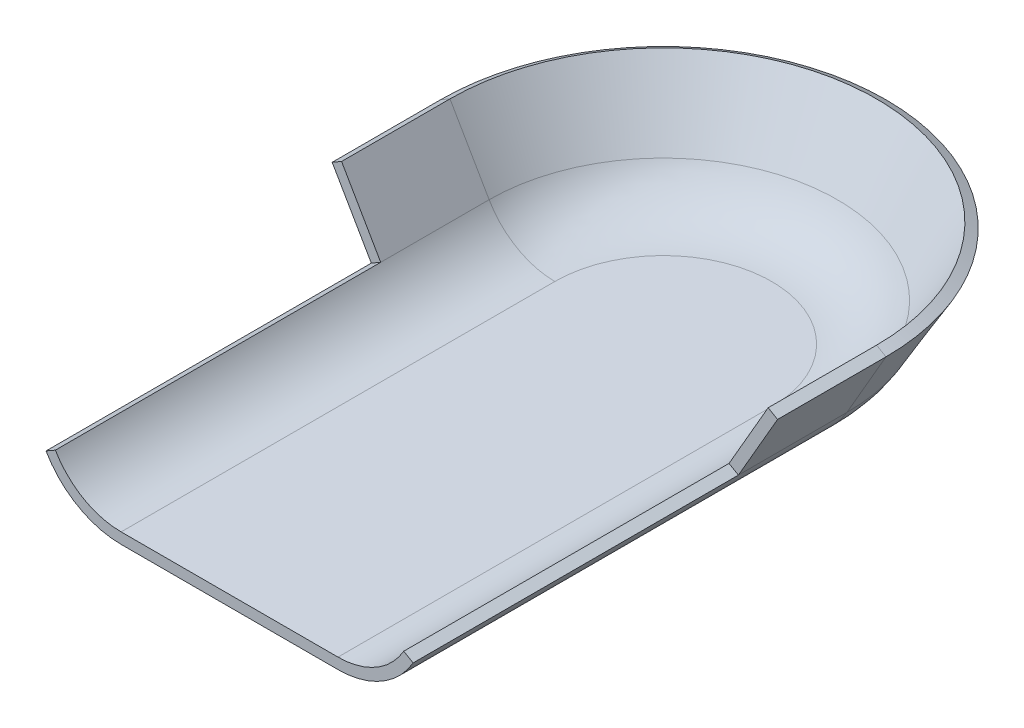
ISO-10303-21;
HEADER;
FILE_DESCRIPTION(('STEP AP214'),'2;1');
FILE_NAME('part.step','',(''),(''),'','','');
FILE_SCHEMA(('AUTOMOTIVE_DESIGN { 1 0 10303 214 1 1 1 1 }'));
ENDSEC;
DATA;
#1=APPLICATION_CONTEXT('core data for automotive mechanical design processes');
#2=APPLICATION_PROTOCOL_DEFINITION('international standard','automotive_design',2000,#1);
#3=PRODUCT_CONTEXT('',#1,'mechanical');
#4=PRODUCT('Part','Part','',(#3));
#5=PRODUCT_RELATED_PRODUCT_CATEGORY('part','',(#4));
#6=PRODUCT_DEFINITION_FORMATION('','',#4);
#7=PRODUCT_DEFINITION_CONTEXT('part definition',#1,'design');
#8=PRODUCT_DEFINITION('design','',#6,#7);
#9=PRODUCT_DEFINITION_SHAPE('','',#8);
#10=(LENGTH_UNIT() NAMED_UNIT(*) SI_UNIT(.MILLI.,.METRE.));
#11=(NAMED_UNIT(*) PLANE_ANGLE_UNIT() SI_UNIT($,.RADIAN.));
#12=(NAMED_UNIT(*) SI_UNIT($,.STERADIAN.) SOLID_ANGLE_UNIT());
#13=UNCERTAINTY_MEASURE_WITH_UNIT(LENGTH_MEASURE(1.E-05),#10,'distance_accuracy_value','');
#14=(GEOMETRIC_REPRESENTATION_CONTEXT(3) GLOBAL_UNCERTAINTY_ASSIGNED_CONTEXT((#13)) GLOBAL_UNIT_ASSIGNED_CONTEXT((#10,
#11,#12)) REPRESENTATION_CONTEXT('',''));
#15=CARTESIAN_POINT('',(0.,0.,0.));
#16=DIRECTION('',(0.,0.,1.));
#17=DIRECTION('',(1.,0.,0.));
#18=AXIS2_PLACEMENT_3D('',#15,#16,#17);
#19=CARTESIAN_POINT('',(25.4,0.,38.1));
#20=DIRECTION('',(0.,0.,-1.));
#21=DIRECTION('',(-1.,0.,0.));
#22=AXIS2_PLACEMENT_3D('',#19,#20,#21);
#23=CYLINDRICAL_SURFACE('',#22,10.16);
#24=DIRECTION('',(0.,0.,-1.));
#25=VECTOR('',#24,1.);
#26=CARTESIAN_POINT('',(25.4,-10.16,38.1));
#27=LINE('',#26,#25);
#28=CARTESIAN_POINT('',(25.4,-10.16,38.1));
#29=VERTEX_POINT('',#28);
#30=CARTESIAN_POINT('',(25.4,-10.16,-12.7));
#31=VERTEX_POINT('',#30);
#32=EDGE_CURVE('E137',#29,#31,#27,.T.);
#33=ORIENTED_EDGE('',*,*,#32,.T.);
#34=CARTESIAN_POINT('',(25.4,0.,-12.7));
#35=DIRECTION('',(0.,0.,-1.));
#36=DIRECTION('',(-1.,0.,0.));
#37=AXIS2_PLACEMENT_3D('',#34,#35,#36);
#38=CIRCLE('',#37,10.16);
#39=CARTESIAN_POINT('',(34.1988181024499,-5.07999999999995,-12.7));
#40=VERTEX_POINT('',#39);
#41=EDGE_CURVE('E322',#40,#31,#38,.T.);
#42=ORIENTED_EDGE('',*,*,#41,.F.);
#43=DIRECTION('',(0.,0.,1.));
#44=VECTOR('',#43,1.);
#45=CARTESIAN_POINT('',(34.1988181024499,-5.07999999999995,-12.7));
#46=LINE('',#45,#44);
#47=CARTESIAN_POINT('',(34.1988181024499,-5.07999999999995,0.));
#48=VERTEX_POINT('',#47);
#49=EDGE_CURVE('E217',#40,#48,#46,.T.);
#50=ORIENTED_EDGE('',*,*,#49,.T.);
#51=DIRECTION('',(0.,0.,-1.));
#52=VECTOR('',#51,1.);
#53=CARTESIAN_POINT('',(34.1988181024499,-5.07999999999995,38.1));
#54=LINE('',#53,#52);
#55=CARTESIAN_POINT('',(34.1988181024499,-5.07999999999995,38.1));
#56=VERTEX_POINT('',#55);
#57=EDGE_CURVE('E12',#56,#48,#54,.T.);
#58=ORIENTED_EDGE('',*,*,#57,.F.);
#59=CARTESIAN_POINT('',(25.4,0.,38.1));
#60=DIRECTION('',(0.,0.,1.));
#61=DIRECTION('',(1.,0.,0.));
#62=AXIS2_PLACEMENT_3D('',#59,#60,#61);
#63=CIRCLE('',#62,10.16);
#64=EDGE_CURVE('E93',#29,#56,#63,.T.);
#65=ORIENTED_EDGE('',*,*,#64,.F.);
#66=EDGE_LOOP('',(#33,#42,#50,#58,#65));
#67=FACE_BOUND('',#66,.T.);
#68=ADVANCED_FACE('F40',(#67),#23,.T.);
#69=CARTESIAN_POINT('',(33.0989658396437,-4.44499999999995,38.1));
#70=DIRECTION('',(0.499999999999995,0.866025403784441,0.));
#71=DIRECTION('',(-0.866025403784441,0.499999999999995,0.));
#72=AXIS2_PLACEMENT_3D('',#69,#70,#71);
#73=PLANE('',#72);
#74=DIRECTION('',(0.866025403784441,-0.499999999999995,0.));
#75=VECTOR('',#74,1.);
#76=CARTESIAN_POINT('',(33.0989658396437,-4.44499999999995,0.));
#77=LINE('',#76,#75);
#78=CARTESIAN_POINT('',(33.0989658396437,-4.44499999999995,0.));
#79=VERTEX_POINT('',#78);
#80=EDGE_CURVE('E138',#79,#48,#77,.T.);
#81=ORIENTED_EDGE('',*,*,#80,.F.);
#82=DIRECTION('',(0.,0.,-1.));
#83=VECTOR('',#82,1.);
#84=CARTESIAN_POINT('',(33.0989658396437,-4.44499999999995,38.1));
#85=LINE('',#84,#83);
#86=CARTESIAN_POINT('',(33.0989658396437,-4.44499999999995,38.1));
#87=VERTEX_POINT('',#86);
#88=EDGE_CURVE('E49',#87,#79,#85,.T.);
#89=ORIENTED_EDGE('',*,*,#88,.F.);
#90=DIRECTION('',(0.866025403784441,-0.499999999999995,0.));
#91=VECTOR('',#90,1.);
#92=CARTESIAN_POINT('',(33.0989658396437,-4.44499999999995,38.1));
#93=LINE('',#92,#91);
#94=EDGE_CURVE('E239',#87,#56,#93,.T.);
#95=ORIENTED_EDGE('',*,*,#94,.T.);
#96=ORIENTED_EDGE('',*,*,#57,.T.);
#97=EDGE_LOOP('',(#81,#89,#95,#96));
#98=FACE_BOUND('',#97,.T.);
#99=ADVANCED_FACE('F176',(#98),#73,.T.);
#100=CARTESIAN_POINT('',(25.4,0.,38.1));
#101=DIRECTION('',(0.,0.,-1.));
#102=DIRECTION('',(-1.,0.,0.));
#103=AXIS2_PLACEMENT_3D('',#100,#101,#102);
#104=CYLINDRICAL_SURFACE('',#103,8.89);
#105=ORIENTED_EDGE('',*,*,#88,.T.);
#106=DIRECTION('',(0.,0.,1.));
#107=VECTOR('',#106,1.);
#108=CARTESIAN_POINT('',(33.0989658396437,-4.44499999999996,-12.7));
#109=LINE('',#108,#107);
#110=CARTESIAN_POINT('',(33.0989658396437,-4.44499999999996,-12.7));
#111=VERTEX_POINT('',#110);
#112=EDGE_CURVE('E170',#111,#79,#109,.T.);
#113=ORIENTED_EDGE('',*,*,#112,.F.);
#114=CARTESIAN_POINT('',(25.4,0.,-12.7));
#115=DIRECTION('',(0.,0.,-1.));
#116=DIRECTION('',(-1.,0.,0.));
#117=AXIS2_PLACEMENT_3D('',#114,#115,#116);
#118=CIRCLE('',#117,8.89);
#119=CARTESIAN_POINT('',(25.4,-8.89,-12.7));
#120=VERTEX_POINT('',#119);
#121=EDGE_CURVE('E359',#111,#120,#118,.T.);
#122=ORIENTED_EDGE('',*,*,#121,.T.);
#123=DIRECTION('',(0.,0.,-1.));
#124=VECTOR('',#123,1.);
#125=CARTESIAN_POINT('',(25.4,-8.89,38.1));
#126=LINE('',#125,#124);
#127=CARTESIAN_POINT('',(25.4,-8.89,38.1));
#128=VERTEX_POINT('',#127);
#129=EDGE_CURVE('E156',#128,#120,#126,.T.);
#130=ORIENTED_EDGE('',*,*,#129,.F.);
#131=CARTESIAN_POINT('',(25.4,0.,38.1));
#132=DIRECTION('',(0.,0.,1.));
#133=DIRECTION('',(1.,0.,0.));
#134=AXIS2_PLACEMENT_3D('',#131,#132,#133);
#135=CIRCLE('',#134,8.89);
#136=EDGE_CURVE('E173',#128,#87,#135,.T.);
#137=ORIENTED_EDGE('',*,*,#136,.T.);
#138=EDGE_LOOP('',(#105,#113,#122,#130,#137));
#139=FACE_BOUND('',#138,.T.);
#140=ADVANCED_FACE('F166',(#139),#104,.F.);
#141=CARTESIAN_POINT('',(0.,-8.89,38.1));
#142=DIRECTION('',(0.,1.,0.));
#143=DIRECTION('',(0.,0.,1.));
#144=AXIS2_PLACEMENT_3D('',#141,#142,#143);
#145=PLANE('',#144);
#146=ORIENTED_EDGE('',*,*,#129,.T.);
#147=CARTESIAN_POINT('',(12.7,-8.88999999999998,-12.7));
#148=DIRECTION('',(0.,1.,0.));
#149=DIRECTION('',(-1.,0.,0.));
#150=AXIS2_PLACEMENT_3D('',#147,#148,#149);
#151=CIRCLE('',#150,12.7);
#152=CARTESIAN_POINT('',(0.,-8.89,-12.7));
#153=VERTEX_POINT('',#152);
#154=EDGE_CURVE('E328',#120,#153,#151,.T.);
#155=ORIENTED_EDGE('',*,*,#154,.T.);
#156=DIRECTION('',(0.,0.,-1.));
#157=VECTOR('',#156,1.);
#158=CARTESIAN_POINT('',(0.,-8.89,38.1));
#159=LINE('',#158,#157);
#160=CARTESIAN_POINT('',(0.,-8.89,38.1));
#161=VERTEX_POINT('',#160);
#162=EDGE_CURVE('E152',#161,#153,#159,.T.);
#163=ORIENTED_EDGE('',*,*,#162,.F.);
#164=DIRECTION('',(1.,0.,0.));
#165=VECTOR('',#164,1.);
#166=CARTESIAN_POINT('',(0.,-8.89,38.1));
#167=LINE('',#166,#165);
#168=EDGE_CURVE('E131',#161,#128,#167,.T.);
#169=ORIENTED_EDGE('',*,*,#168,.T.);
#170=EDGE_LOOP('',(#146,#155,#163,#169));
#171=FACE_BOUND('',#170,.T.);
#172=ADVANCED_FACE('F245',(#171),#145,.T.);
#173=CARTESIAN_POINT('',(0.,0.,38.1));
#174=DIRECTION('',(0.,0.,-1.));
#175=DIRECTION('',(-1.,0.,0.));
#176=AXIS2_PLACEMENT_3D('',#173,#174,#175);
#177=CYLINDRICAL_SURFACE('',#176,8.89);
#178=ORIENTED_EDGE('',*,*,#162,.T.);
#179=CARTESIAN_POINT('',(0.,0.,-12.7));
#180=DIRECTION('',(0.,0.,-1.));
#181=DIRECTION('',(-1.,0.,0.));
#182=AXIS2_PLACEMENT_3D('',#179,#180,#181);
#183=CIRCLE('',#182,8.89);
#184=CARTESIAN_POINT('',(-7.69896583964368,-4.44499999999996,-12.7));
#185=VERTEX_POINT('',#184);
#186=EDGE_CURVE('E256',#153,#185,#183,.T.);
#187=ORIENTED_EDGE('',*,*,#186,.T.);
#188=DIRECTION('',(0.,0.,1.));
#189=VECTOR('',#188,1.);
#190=CARTESIAN_POINT('',(-7.69896583964368,-4.44499999999996,-12.7));
#191=LINE('',#190,#189);
#192=CARTESIAN_POINT('',(-7.69896583964369,-4.44499999999995,0.));
#193=VERTEX_POINT('',#192);
#194=EDGE_CURVE('E192',#185,#193,#191,.T.);
#195=ORIENTED_EDGE('',*,*,#194,.T.);
#196=DIRECTION('',(0.,0.,-1.));
#197=VECTOR('',#196,1.);
#198=CARTESIAN_POINT('',(-7.69896583964369,-4.44499999999995,38.1));
#199=LINE('',#198,#197);
#200=CARTESIAN_POINT('',(-7.69896583964369,-4.44499999999995,38.1));
#201=VERTEX_POINT('',#200);
#202=EDGE_CURVE('E78',#201,#193,#199,.T.);
#203=ORIENTED_EDGE('',*,*,#202,.F.);
#204=CARTESIAN_POINT('',(0.,0.,38.1));
#205=DIRECTION('',(0.,0.,1.));
#206=DIRECTION('',(1.,0.,0.));
#207=AXIS2_PLACEMENT_3D('',#204,#205,#206);
#208=CIRCLE('',#207,8.89);
#209=EDGE_CURVE('E128',#201,#161,#208,.T.);
#210=ORIENTED_EDGE('',*,*,#209,.T.);
#211=EDGE_LOOP('',(#178,#187,#195,#203,#210));
#212=FACE_BOUND('',#211,.T.);
#213=ADVANCED_FACE('F249',(#212),#177,.F.);
#214=CARTESIAN_POINT('',(-8.79881810244993,-5.07999999999994,38.1));
#215=DIRECTION('',(-0.499999999999995,0.866025403784442,0.));
#216=DIRECTION('',(-0.866025403784442,-0.499999999999995,0.));
#217=AXIS2_PLACEMENT_3D('',#214,#215,#216);
#218=PLANE('',#217);
#219=DIRECTION('',(0.866025403784442,0.499999999999995,0.));
#220=VECTOR('',#219,1.);
#221=CARTESIAN_POINT('',(-8.79881810244993,-5.07999999999994,0.));
#222=LINE('',#221,#220);
#223=CARTESIAN_POINT('',(-8.79881810244993,-5.07999999999994,0.));
#224=VERTEX_POINT('',#223);
#225=EDGE_CURVE('E112',#224,#193,#222,.T.);
#226=ORIENTED_EDGE('',*,*,#225,.F.);
#227=DIRECTION('',(0.,0.,-1.));
#228=VECTOR('',#227,1.);
#229=CARTESIAN_POINT('',(-8.79881810244993,-5.07999999999994,38.1));
#230=LINE('',#229,#228);
#231=CARTESIAN_POINT('',(-8.79881810244993,-5.07999999999994,38.1));
#232=VERTEX_POINT('',#231);
#233=EDGE_CURVE('E87',#232,#224,#230,.T.);
#234=ORIENTED_EDGE('',*,*,#233,.F.);
#235=DIRECTION('',(0.866025403784442,0.499999999999995,0.));
#236=VECTOR('',#235,1.);
#237=CARTESIAN_POINT('',(-8.79881810244993,-5.07999999999994,38.1));
#238=LINE('',#237,#236);
#239=EDGE_CURVE('E111',#232,#201,#238,.T.);
#240=ORIENTED_EDGE('',*,*,#239,.T.);
#241=ORIENTED_EDGE('',*,*,#202,.T.);
#242=EDGE_LOOP('',(#226,#234,#240,#241));
#243=FACE_BOUND('',#242,.T.);
#244=ADVANCED_FACE('F109',(#243),#218,.T.);
#245=CARTESIAN_POINT('',(0.,0.,38.1));
#246=DIRECTION('',(0.,0.,-1.));
#247=DIRECTION('',(-1.,0.,0.));
#248=AXIS2_PLACEMENT_3D('',#245,#246,#247);
#249=CYLINDRICAL_SURFACE('',#248,10.16);
#250=ORIENTED_EDGE('',*,*,#233,.T.);
#251=DIRECTION('',(0.,0.,1.));
#252=VECTOR('',#251,1.);
#253=CARTESIAN_POINT('',(-8.79881810244992,-5.07999999999995,-12.7));
#254=LINE('',#253,#252);
#255=CARTESIAN_POINT('',(-8.79881810244992,-5.07999999999995,-12.7));
#256=VERTEX_POINT('',#255);
#257=EDGE_CURVE('E214',#256,#224,#254,.T.);
#258=ORIENTED_EDGE('',*,*,#257,.F.);
#259=CARTESIAN_POINT('',(0.,0.,-12.7));
#260=DIRECTION('',(0.,0.,-1.));
#261=DIRECTION('',(-1.,0.,0.));
#262=AXIS2_PLACEMENT_3D('',#259,#260,#261);
#263=CIRCLE('',#262,10.16);
#264=CARTESIAN_POINT('',(0.,-10.16,-12.7));
#265=VERTEX_POINT('',#264);
#266=EDGE_CURVE('E218',#265,#256,#263,.T.);
#267=ORIENTED_EDGE('',*,*,#266,.F.);
#268=DIRECTION('',(0.,0.,-1.));
#269=VECTOR('',#268,1.);
#270=CARTESIAN_POINT('',(0.,-10.16,38.1));
#271=LINE('',#270,#269);
#272=CARTESIAN_POINT('',(0.,-10.16,38.1));
#273=VERTEX_POINT('',#272);
#274=EDGE_CURVE('E115',#273,#265,#271,.T.);
#275=ORIENTED_EDGE('',*,*,#274,.F.);
#276=CARTESIAN_POINT('',(0.,0.,38.1));
#277=DIRECTION('',(0.,0.,1.));
#278=DIRECTION('',(1.,0.,0.));
#279=AXIS2_PLACEMENT_3D('',#276,#277,#278);
#280=CIRCLE('',#279,10.16);
#281=EDGE_CURVE('E118',#232,#273,#280,.T.);
#282=ORIENTED_EDGE('',*,*,#281,.F.);
#283=EDGE_LOOP('',(#250,#258,#267,#275,#282));
#284=FACE_BOUND('',#283,.T.);
#285=ADVANCED_FACE('F119',(#284),#249,.T.);
#286=CARTESIAN_POINT('',(0.,-10.16,38.1));
#287=DIRECTION('',(0.,1.,0.));
#288=DIRECTION('',(0.,0.,1.));
#289=AXIS2_PLACEMENT_3D('',#286,#287,#288);
#290=PLANE('',#289);
#291=ORIENTED_EDGE('',*,*,#274,.T.);
#292=CARTESIAN_POINT('',(12.7,-10.16,-12.7));
#293=DIRECTION('',(0.,1.,0.));
#294=DIRECTION('',(-1.,0.,0.));
#295=AXIS2_PLACEMENT_3D('',#292,#293,#294);
#296=CIRCLE('',#295,12.7);
#297=EDGE_CURVE('E316',#31,#265,#296,.T.);
#298=ORIENTED_EDGE('',*,*,#297,.F.);
#299=ORIENTED_EDGE('',*,*,#32,.F.);
#300=DIRECTION('',(1.,0.,0.));
#301=VECTOR('',#300,1.);
#302=CARTESIAN_POINT('',(0.,-10.16,38.1));
#303=LINE('',#302,#301);
#304=EDGE_CURVE('E59',#273,#29,#303,.T.);
#305=ORIENTED_EDGE('',*,*,#304,.F.);
#306=EDGE_LOOP('',(#291,#298,#299,#305));
#307=FACE_BOUND('',#306,.T.);
#308=ADVANCED_FACE('F313',(#307),#290,.F.);
#309=CARTESIAN_POINT('',(25.4,0.,38.1));
#310=DIRECTION('',(0.,0.,1.));
#311=DIRECTION('',(1.,0.,0.));
#312=AXIS2_PLACEMENT_3D('',#309,#310,#311);
#313=PLANE('',#312);
#314=ORIENTED_EDGE('',*,*,#64,.T.);
#315=ORIENTED_EDGE('',*,*,#94,.F.);
#316=ORIENTED_EDGE('',*,*,#136,.F.);
#317=ORIENTED_EDGE('',*,*,#168,.F.);
#318=ORIENTED_EDGE('',*,*,#209,.F.);
#319=ORIENTED_EDGE('',*,*,#239,.F.);
#320=ORIENTED_EDGE('',*,*,#281,.T.);
#321=ORIENTED_EDGE('',*,*,#304,.T.);
#322=EDGE_LOOP('',(#314,#315,#316,#317,#318,#319,#320,#321));
#323=FACE_BOUND('',#322,.T.);
#324=ADVANCED_FACE('F125',(#323),#313,.T.);
#325=CARTESIAN_POINT('',(0.,0.,0.));
#326=DIRECTION('',(0.,0.,-1.));
#327=DIRECTION('',(-1.,0.,0.));
#328=AXIS2_PLACEMENT_3D('',#325,#326,#327);
#329=PLANE('',#328);
#330=DIRECTION('',(-0.499999999999996,0.866025403784441,0.));
#331=VECTOR('',#330,1.);
#332=CARTESIAN_POINT('',(-8.79881810244992,-5.07999999999995,0.));
#333=LINE('',#332,#331);
#334=CARTESIAN_POINT('',(-13.3815358641425,2.8575,0.));
#335=VERTEX_POINT('',#334);
#336=EDGE_CURVE('E347',#224,#335,#333,.T.);
#337=ORIENTED_EDGE('',*,*,#336,.F.);
#338=ORIENTED_EDGE('',*,*,#225,.T.);
#339=DIRECTION('',(-0.499999999999996,0.866025403784441,0.));
#340=VECTOR('',#339,1.);
#341=CARTESIAN_POINT('',(-7.69896583964368,-4.44499999999996,0.));
#342=LINE('',#341,#340);
#343=CARTESIAN_POINT('',(-12.2816836013363,3.4925,0.));
#344=VERTEX_POINT('',#343);
#345=EDGE_CURVE('E199',#193,#344,#342,.T.);
#346=ORIENTED_EDGE('',*,*,#345,.T.);
#347=DIRECTION('',(-0.866025403784441,-0.499999999999996,0.));
#348=VECTOR('',#347,1.);
#349=CARTESIAN_POINT('',(-12.2816836013363,3.4925,0.));
#350=LINE('',#349,#348);
#351=EDGE_CURVE('E207',#344,#335,#350,.T.);
#352=ORIENTED_EDGE('',*,*,#351,.T.);
#353=EDGE_LOOP('',(#337,#338,#346,#352));
#354=FACE_BOUND('',#353,.T.);
#355=ADVANCED_FACE('F267',(#354),#329,.F.);
#356=DIRECTION('',(-0.499999999999995,-0.866025403784441,0.));
#357=VECTOR('',#356,1.);
#358=CARTESIAN_POINT('',(33.0989658396437,-4.44499999999996,0.));
#359=LINE('',#358,#357);
#360=CARTESIAN_POINT('',(37.6816836013362,3.49249999999999,0.));
#361=VERTEX_POINT('',#360);
#362=EDGE_CURVE('E186',#361,#79,#359,.T.);
#363=ORIENTED_EDGE('',*,*,#362,.T.);
#364=ORIENTED_EDGE('',*,*,#80,.T.);
#365=DIRECTION('',(-0.499999999999995,-0.866025403784441,0.));
#366=VECTOR('',#365,1.);
#367=CARTESIAN_POINT('',(34.1988181024499,-5.07999999999995,0.));
#368=LINE('',#367,#366);
#369=CARTESIAN_POINT('',(38.7815358641425,2.8575,0.));
#370=VERTEX_POINT('',#369);
#371=EDGE_CURVE('E203',#370,#48,#368,.T.);
#372=ORIENTED_EDGE('',*,*,#371,.F.);
#373=DIRECTION('',(-0.866025403784442,0.499999999999994,0.));
#374=VECTOR('',#373,1.);
#375=CARTESIAN_POINT('',(38.7815358641425,2.8575,0.));
#376=LINE('',#375,#374);
#377=EDGE_CURVE('E197',#370,#361,#376,.T.);
#378=ORIENTED_EDGE('',*,*,#377,.T.);
#379=EDGE_LOOP('',(#363,#364,#372,#378));
#380=FACE_BOUND('',#379,.T.);
#381=ADVANCED_FACE('F195',(#380),#329,.F.);
#382=CARTESIAN_POINT('',(-8.79881810244992,-5.07999999999995,-12.7));
#383=DIRECTION('',(0.866025403784441,0.499999999999996,0.));
#384=DIRECTION('',(-0.499999999999996,0.866025403784441,0.));
#385=AXIS2_PLACEMENT_3D('',#382,#383,#384);
#386=PLANE('',#385);
#387=ORIENTED_EDGE('',*,*,#336,.T.);
#388=DIRECTION('',(0.,0.,1.));
#389=VECTOR('',#388,1.);
#390=CARTESIAN_POINT('',(-13.3815358641425,2.8575,-12.7));
#391=LINE('',#390,#389);
#392=CARTESIAN_POINT('',(-13.3815358641425,2.8575,-12.7));
#393=VERTEX_POINT('',#392);
#394=EDGE_CURVE('E142',#393,#335,#391,.T.);
#395=ORIENTED_EDGE('',*,*,#394,.F.);
#396=DIRECTION('',(-0.499999999999996,0.866025403784441,0.));
#397=VECTOR('',#396,1.);
#398=CARTESIAN_POINT('',(-8.79881810244992,-5.07999999999995,-12.7));
#399=LINE('',#398,#397);
#400=EDGE_CURVE('E213',#256,#393,#399,.T.);
#401=ORIENTED_EDGE('',*,*,#400,.F.);
#402=ORIENTED_EDGE('',*,*,#257,.T.);
#403=EDGE_LOOP('',(#387,#395,#401,#402));
#404=FACE_BOUND('',#403,.T.);
#405=ADVANCED_FACE('F375',(#404),#386,.F.);
#406=CARTESIAN_POINT('',(-12.2816836013363,3.4925,-12.7));
#407=DIRECTION('',(-0.499999999999996,0.866025403784441,0.));
#408=DIRECTION('',(-0.866025403784441,-0.499999999999996,0.));
#409=AXIS2_PLACEMENT_3D('',#406,#407,#408);
#410=PLANE('',#409);
#411=ORIENTED_EDGE('',*,*,#351,.F.);
#412=DIRECTION('',(0.,0.,1.));
#413=VECTOR('',#412,1.);
#414=CARTESIAN_POINT('',(-12.2816836013363,3.4925,-12.7));
#415=LINE('',#414,#413);
#416=CARTESIAN_POINT('',(-12.2816836013363,3.4925,-12.7));
#417=VERTEX_POINT('',#416);
#418=EDGE_CURVE('E230',#417,#344,#415,.T.);
#419=ORIENTED_EDGE('',*,*,#418,.F.);
#420=DIRECTION('',(-0.866025403784441,-0.499999999999996,0.));
#421=VECTOR('',#420,1.);
#422=CARTESIAN_POINT('',(-12.2816836013363,3.4925,-12.7));
#423=LINE('',#422,#421);
#424=EDGE_CURVE('E351',#417,#393,#423,.T.);
#425=ORIENTED_EDGE('',*,*,#424,.T.);
#426=ORIENTED_EDGE('',*,*,#394,.T.);
#427=EDGE_LOOP('',(#411,#419,#425,#426));
#428=FACE_BOUND('',#427,.T.);
#429=ADVANCED_FACE('F397',(#428),#410,.T.);
#430=CARTESIAN_POINT('',(-7.69896583964368,-4.44499999999996,-12.7));
#431=DIRECTION('',(0.866025403784441,0.499999999999996,0.));
#432=DIRECTION('',(-0.499999999999996,0.866025403784441,0.));
#433=AXIS2_PLACEMENT_3D('',#430,#431,#432);
#434=PLANE('',#433);
#435=ORIENTED_EDGE('',*,*,#345,.F.);
#436=ORIENTED_EDGE('',*,*,#194,.F.);
#437=DIRECTION('',(-0.499999999999996,0.866025403784441,0.));
#438=VECTOR('',#437,1.);
#439=CARTESIAN_POINT('',(-7.69896583964368,-4.44499999999996,-12.7));
#440=LINE('',#439,#438);
#441=EDGE_CURVE('E354',#185,#417,#440,.T.);
#442=ORIENTED_EDGE('',*,*,#441,.T.);
#443=ORIENTED_EDGE('',*,*,#418,.T.);
#444=EDGE_LOOP('',(#435,#436,#442,#443));
#445=FACE_BOUND('',#444,.T.);
#446=ADVANCED_FACE('F260',(#445),#434,.T.);
#447=CARTESIAN_POINT('',(33.0989658396437,-4.44499999999996,-12.7));
#448=DIRECTION('',(-0.866025403784441,0.499999999999995,0.));
#449=DIRECTION('',(-0.499999999999995,-0.866025403784441,0.));
#450=AXIS2_PLACEMENT_3D('',#447,#448,#449);
#451=PLANE('',#450);
#452=ORIENTED_EDGE('',*,*,#362,.F.);
#453=DIRECTION('',(0.,0.,1.));
#454=VECTOR('',#453,1.);
#455=CARTESIAN_POINT('',(37.6816836013362,3.49249999999999,-12.7));
#456=LINE('',#455,#454);
#457=CARTESIAN_POINT('',(37.6816836013362,3.49249999999999,-12.7));
#458=VERTEX_POINT('',#457);
#459=EDGE_CURVE('E193',#458,#361,#456,.T.);
#460=ORIENTED_EDGE('',*,*,#459,.F.);
#461=DIRECTION('',(-0.499999999999995,-0.866025403784441,0.));
#462=VECTOR('',#461,1.);
#463=CARTESIAN_POINT('',(33.0989658396437,-4.44499999999996,-12.7));
#464=LINE('',#463,#462);
#465=EDGE_CURVE('E189',#458,#111,#464,.T.);
#466=ORIENTED_EDGE('',*,*,#465,.T.);
#467=ORIENTED_EDGE('',*,*,#112,.T.);
#468=EDGE_LOOP('',(#452,#460,#466,#467));
#469=FACE_BOUND('',#468,.T.);
#470=ADVANCED_FACE('F183',(#469),#451,.T.);
#471=CARTESIAN_POINT('',(38.7815358641425,2.8575,-12.7));
#472=DIRECTION('',(0.499999999999994,0.866025403784442,0.));
#473=DIRECTION('',(-0.866025403784442,0.499999999999994,0.));
#474=AXIS2_PLACEMENT_3D('',#471,#472,#473);
#475=PLANE('',#474);
#476=ORIENTED_EDGE('',*,*,#377,.F.);
#477=DIRECTION('',(0.,0.,1.));
#478=VECTOR('',#477,1.);
#479=CARTESIAN_POINT('',(38.7815358641425,2.8575,-12.7));
#480=LINE('',#479,#478);
#481=CARTESIAN_POINT('',(38.7815358641425,2.8575,-12.7));
#482=VERTEX_POINT('',#481);
#483=EDGE_CURVE('E222',#482,#370,#480,.T.);
#484=ORIENTED_EDGE('',*,*,#483,.F.);
#485=DIRECTION('',(-0.866025403784442,0.499999999999994,0.));
#486=VECTOR('',#485,1.);
#487=CARTESIAN_POINT('',(38.7815358641425,2.8575,-12.7));
#488=LINE('',#487,#486);
#489=EDGE_CURVE('E364',#482,#458,#488,.T.);
#490=ORIENTED_EDGE('',*,*,#489,.T.);
#491=ORIENTED_EDGE('',*,*,#459,.T.);
#492=EDGE_LOOP('',(#476,#484,#490,#491));
#493=FACE_BOUND('',#492,.T.);
#494=ADVANCED_FACE('F438',(#493),#475,.T.);
#495=CARTESIAN_POINT('',(34.1988181024499,-5.07999999999995,-12.7));
#496=DIRECTION('',(-0.866025403784441,0.499999999999995,0.));
#497=DIRECTION('',(-0.499999999999995,-0.866025403784441,0.));
#498=AXIS2_PLACEMENT_3D('',#495,#496,#497);
#499=PLANE('',#498);
#500=ORIENTED_EDGE('',*,*,#371,.T.);
#501=ORIENTED_EDGE('',*,*,#49,.F.);
#502=DIRECTION('',(-0.499999999999995,-0.866025403784441,0.));
#503=VECTOR('',#502,1.);
#504=CARTESIAN_POINT('',(34.1988181024499,-5.07999999999995,-12.7));
#505=LINE('',#504,#503);
#506=EDGE_CURVE('E367',#482,#40,#505,.T.);
#507=ORIENTED_EDGE('',*,*,#506,.F.);
#508=ORIENTED_EDGE('',*,*,#483,.T.);
#509=EDGE_LOOP('',(#500,#501,#507,#508));
#510=FACE_BOUND('',#509,.T.);
#511=ADVANCED_FACE('F381',(#510),#499,.F.);
#512=CARTESIAN_POINT('',(12.7,-5.07999999999992,-12.7));
#513=DIRECTION('',(0.,1.,0.));
#514=DIRECTION('',(-1.,0.,0.));
#515=AXIS2_PLACEMENT_3D('',#512,#513,#514);
#516=CONICAL_SURFACE('',#515,21.4988181024499,0.523598775598292);
#517=CARTESIAN_POINT('',(12.7,2.85750000000004,-12.7));
#518=DIRECTION('',(0.,1.,0.));
#519=DIRECTION('',(-1.,0.,0.));
#520=AXIS2_PLACEMENT_3D('',#517,#518,#519);
#521=CIRCLE('',#520,26.0815358641425);
#522=EDGE_CURVE('E343',#482,#393,#521,.T.);
#523=ORIENTED_EDGE('',*,*,#522,.F.);
#524=ORIENTED_EDGE('',*,*,#506,.T.);
#525=CARTESIAN_POINT('',(12.7,-5.07999999999992,-12.7));
#526=DIRECTION('',(0.,1.,0.));
#527=DIRECTION('',(-1.,0.,0.));
#528=AXIS2_PLACEMENT_3D('',#525,#526,#527);
#529=CIRCLE('',#528,21.4988181024499);
#530=EDGE_CURVE('E329',#40,#256,#529,.T.);
#531=ORIENTED_EDGE('',*,*,#530,.T.);
#532=ORIENTED_EDGE('',*,*,#400,.T.);
#533=EDGE_LOOP('',(#523,#524,#531,#532));
#534=FACE_BOUND('',#533,.T.);
#535=ADVANCED_FACE('F379',(#534),#516,.T.);
#536=CARTESIAN_POINT('',(12.7,3.49250000000003,-12.7));
#537=DIRECTION('',(0.,-1.,0.));
#538=DIRECTION('',(1.,0.,0.));
#539=AXIS2_PLACEMENT_3D('',#536,#537,#538);
#540=CONICAL_SURFACE('',#539,24.9816836013362,1.0471975511966);
#541=CARTESIAN_POINT('',(12.7,3.49250000000003,-12.7));
#542=DIRECTION('',(0.,1.,0.));
#543=DIRECTION('',(-1.,0.,0.));
#544=AXIS2_PLACEMENT_3D('',#541,#542,#543);
#545=CIRCLE('',#544,24.9816836013362);
#546=EDGE_CURVE('E339',#458,#417,#545,.T.);
#547=ORIENTED_EDGE('',*,*,#546,.F.);
#548=ORIENTED_EDGE('',*,*,#489,.F.);
#549=ORIENTED_EDGE('',*,*,#522,.T.);
#550=ORIENTED_EDGE('',*,*,#424,.F.);
#551=EDGE_LOOP('',(#547,#548,#549,#550));
#552=FACE_BOUND('',#551,.T.);
#553=ADVANCED_FACE('F395',(#552),#540,.T.);
#554=CARTESIAN_POINT('',(12.7,-4.44499999999993,-12.7));
#555=DIRECTION('',(0.,1.,0.));
#556=DIRECTION('',(-1.,0.,0.));
#557=AXIS2_PLACEMENT_3D('',#554,#555,#556);
#558=CONICAL_SURFACE('',#557,20.3989658396437,0.523598775598292);
#559=CARTESIAN_POINT('',(12.7,-4.44499999999993,-12.7));
#560=DIRECTION('',(0.,1.,0.));
#561=DIRECTION('',(-1.,0.,0.));
#562=AXIS2_PLACEMENT_3D('',#559,#560,#561);
#563=CIRCLE('',#562,20.3989658396437);
#564=EDGE_CURVE('E332',#111,#185,#563,.T.);
#565=ORIENTED_EDGE('',*,*,#564,.F.);
#566=ORIENTED_EDGE('',*,*,#465,.F.);
#567=ORIENTED_EDGE('',*,*,#546,.T.);
#568=ORIENTED_EDGE('',*,*,#441,.F.);
#569=EDGE_LOOP('',(#565,#566,#567,#568));
#570=FACE_BOUND('',#569,.T.);
#571=ADVANCED_FACE('F391',(#570),#558,.F.);
#572=CARTESIAN_POINT('',(12.7,0.,-12.7));
#573=DIRECTION('',(0.,1.,0.));
#574=DIRECTION('',(-1.,0.,0.));
#575=AXIS2_PLACEMENT_3D('',#572,#573,#574);
#576=TOROIDAL_SURFACE('',#575,12.7,8.89);
#577=ORIENTED_EDGE('',*,*,#154,.F.);
#578=ORIENTED_EDGE('',*,*,#121,.F.);
#579=ORIENTED_EDGE('',*,*,#564,.T.);
#580=ORIENTED_EDGE('',*,*,#186,.F.);
#581=EDGE_LOOP('',(#577,#578,#579,#580));
#582=FACE_BOUND('',#581,.T.);
#583=ADVANCED_FACE('F387',(#582),#576,.F.);
#584=CARTESIAN_POINT('',(12.7,0.,-12.7));
#585=DIRECTION('',(0.,1.,0.));
#586=DIRECTION('',(-1.,0.,0.));
#587=AXIS2_PLACEMENT_3D('',#584,#585,#586);
#588=TOROIDAL_SURFACE('',#587,12.7,10.16);
#589=ORIENTED_EDGE('',*,*,#41,.T.);
#590=ORIENTED_EDGE('',*,*,#297,.T.);
#591=ORIENTED_EDGE('',*,*,#266,.T.);
#592=ORIENTED_EDGE('',*,*,#530,.F.);
#593=EDGE_LOOP('',(#589,#590,#591,#592));
#594=FACE_BOUND('',#593,.T.);
#595=ADVANCED_FACE('F325',(#594),#588,.T.);
#596=CLOSED_SHELL('',(#68,#99,#140,#172,#213,#244,#285,#308,#324,#355,#381,#405,#429,#446,#470,
#494,#511,#535,#553,#571,#583,#595));
#597=MANIFOLD_SOLID_BREP('B2',#596);
#598=ADVANCED_BREP_SHAPE_REPRESENTATION('',(#18,#597),#14);
#599=SHAPE_DEFINITION_REPRESENTATION(#9,#598);
ENDSEC;
END-ISO-10303-21;
